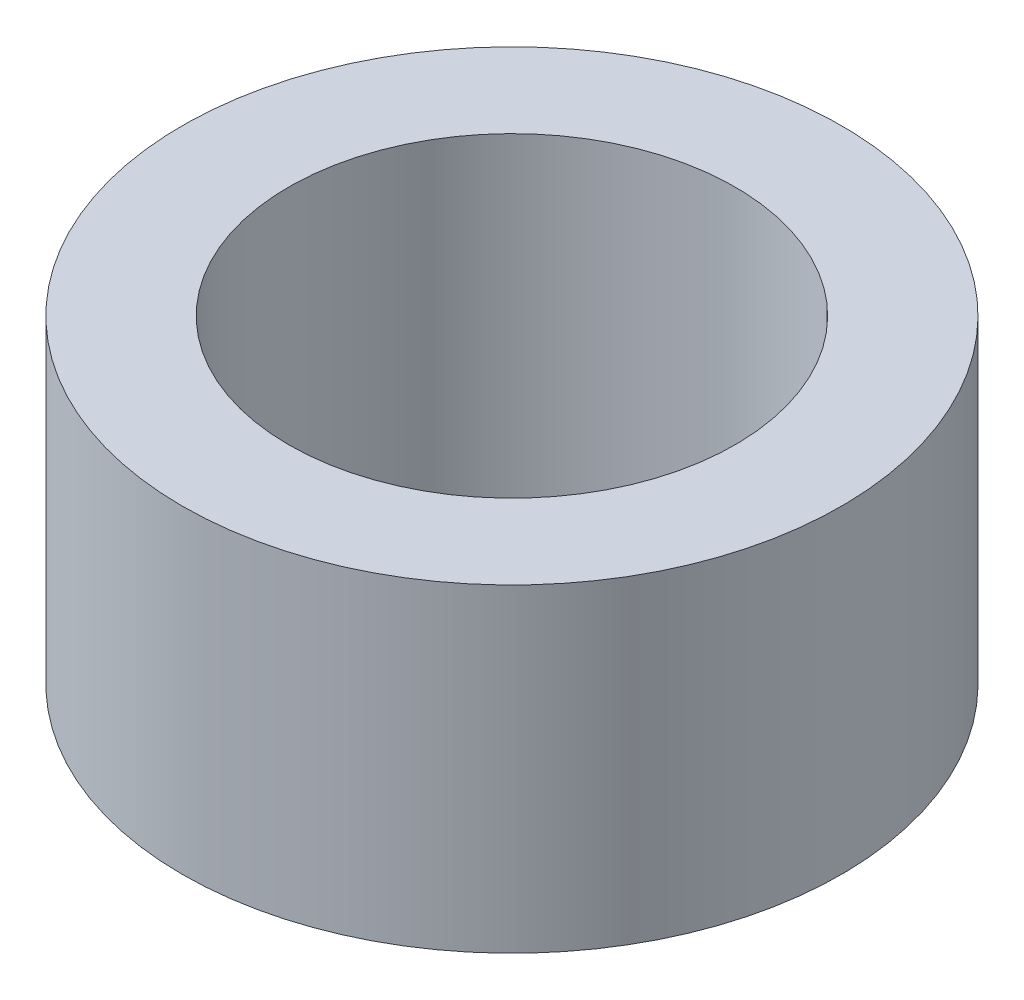
ISO-10303-21;
HEADER;
FILE_DESCRIPTION(('STEP AP214'),'2;1');
FILE_NAME('part.step','',(''),(''),'','','');
FILE_SCHEMA(('AUTOMOTIVE_DESIGN { 1 0 10303 214 1 1 1 1 }'));
ENDSEC;
DATA;
#1=APPLICATION_CONTEXT('core data for automotive mechanical design processes');
#2=APPLICATION_PROTOCOL_DEFINITION('international standard','automotive_design',2000,#1);
#3=PRODUCT_CONTEXT('',#1,'mechanical');
#4=PRODUCT('Part','Part','',(#3));
#5=PRODUCT_RELATED_PRODUCT_CATEGORY('part','',(#4));
#6=PRODUCT_DEFINITION_FORMATION('','',#4);
#7=PRODUCT_DEFINITION_CONTEXT('part definition',#1,'design');
#8=PRODUCT_DEFINITION('design','',#6,#7);
#9=PRODUCT_DEFINITION_SHAPE('','',#8);
#10=(LENGTH_UNIT() NAMED_UNIT(*) SI_UNIT(.MILLI.,.METRE.));
#11=(NAMED_UNIT(*) PLANE_ANGLE_UNIT() SI_UNIT($,.RADIAN.));
#12=(NAMED_UNIT(*) SI_UNIT($,.STERADIAN.) SOLID_ANGLE_UNIT());
#13=UNCERTAINTY_MEASURE_WITH_UNIT(LENGTH_MEASURE(1.E-05),#10,'distance_accuracy_value','');
#14=(GEOMETRIC_REPRESENTATION_CONTEXT(3) GLOBAL_UNCERTAINTY_ASSIGNED_CONTEXT((#13)) GLOBAL_UNIT_ASSIGNED_CONTEXT((#10,
#11,#12)) REPRESENTATION_CONTEXT('',''));
#15=CARTESIAN_POINT('',(0.,0.,0.));
#16=DIRECTION('',(0.,0.,1.));
#17=DIRECTION('',(1.,0.,0.));
#18=AXIS2_PLACEMENT_3D('',#15,#16,#17);
#19=CARTESIAN_POINT('',(0.,3.,0.));
#20=DIRECTION('',(0.,1.,0.));
#21=DIRECTION('',(0.,0.,1.));
#22=AXIS2_PLACEMENT_3D('',#19,#20,#21);
#23=PLANE('',#22);
#24=CARTESIAN_POINT('',(0.,3.,0.));
#25=DIRECTION('',(0.,1.,0.));
#26=DIRECTION('',(0.,0.,1.));
#27=AXIS2_PLACEMENT_3D('',#24,#25,#26);
#28=CIRCLE('',#27,3.1);
#29=CARTESIAN_POINT('',(0.,3.,3.1));
#30=VERTEX_POINT('',#29);
#31=EDGE_CURVE('E10',#30,#30,#28,.T.);
#32=ORIENTED_EDGE('',*,*,#31,.T.);
#33=EDGE_LOOP('',(#32));
#34=FACE_BOUND('',#33,.T.);
#35=CARTESIAN_POINT('',(0.,3.,0.));
#36=DIRECTION('',(0.,1.,0.));
#37=DIRECTION('',(0.,0.,1.));
#38=AXIS2_PLACEMENT_3D('',#35,#36,#37);
#39=CIRCLE('',#38,2.1);
#40=CARTESIAN_POINT('',(0.,3.,2.1));
#41=VERTEX_POINT('',#40);
#42=EDGE_CURVE('E49',#41,#41,#39,.T.);
#43=ORIENTED_EDGE('',*,*,#42,.F.);
#44=EDGE_LOOP('',(#43));
#45=FACE_BOUND('',#44,.T.);
#46=ADVANCED_FACE('F36',(#34,#45),#23,.T.);
#47=CARTESIAN_POINT('',(0.,0.,0.));
#48=DIRECTION('',(0.,1.,0.));
#49=DIRECTION('',(0.,0.,1.));
#50=AXIS2_PLACEMENT_3D('',#47,#48,#49);
#51=PLANE('',#50);
#52=CARTESIAN_POINT('',(0.,0.,0.));
#53=DIRECTION('',(0.,1.,0.));
#54=DIRECTION('',(0.,0.,1.));
#55=AXIS2_PLACEMENT_3D('',#52,#53,#54);
#56=CIRCLE('',#55,3.1);
#57=CARTESIAN_POINT('',(0.,0.,3.1));
#58=VERTEX_POINT('',#57);
#59=EDGE_CURVE('E40',#58,#58,#56,.T.);
#60=ORIENTED_EDGE('',*,*,#59,.F.);
#61=EDGE_LOOP('',(#60));
#62=FACE_BOUND('',#61,.T.);
#63=CARTESIAN_POINT('',(0.,0.,0.));
#64=DIRECTION('',(0.,1.,0.));
#65=DIRECTION('',(0.,0.,1.));
#66=AXIS2_PLACEMENT_3D('',#63,#64,#65);
#67=CIRCLE('',#66,2.1);
#68=CARTESIAN_POINT('',(0.,0.,2.1));
#69=VERTEX_POINT('',#68);
#70=EDGE_CURVE('E51',#69,#69,#67,.T.);
#71=ORIENTED_EDGE('',*,*,#70,.T.);
#72=EDGE_LOOP('',(#71));
#73=FACE_BOUND('',#72,.T.);
#74=ADVANCED_FACE('F63',(#62,#73),#51,.F.);
#75=CARTESIAN_POINT('',(0.,3.,0.));
#76=DIRECTION('',(0.,-1.,0.));
#77=DIRECTION('',(0.,0.,-1.));
#78=AXIS2_PLACEMENT_3D('',#75,#76,#77);
#79=CYLINDRICAL_SURFACE('',#78,3.1);
#80=ORIENTED_EDGE('',*,*,#31,.F.);
#81=EDGE_LOOP('',(#80));
#82=FACE_BOUND('',#81,.T.);
#83=ORIENTED_EDGE('',*,*,#59,.T.);
#84=EDGE_LOOP('',(#83));
#85=FACE_BOUND('',#84,.T.);
#86=ADVANCED_FACE('F38',(#82,#85),#79,.T.);
#87=CARTESIAN_POINT('',(0.,3.,0.));
#88=DIRECTION('',(0.,-1.,0.));
#89=DIRECTION('',(0.,0.,-1.));
#90=AXIS2_PLACEMENT_3D('',#87,#88,#89);
#91=CYLINDRICAL_SURFACE('',#90,2.1);
#92=ORIENTED_EDGE('',*,*,#42,.T.);
#93=EDGE_LOOP('',(#92));
#94=FACE_BOUND('',#93,.T.);
#95=ORIENTED_EDGE('',*,*,#70,.F.);
#96=EDGE_LOOP('',(#95));
#97=FACE_BOUND('',#96,.T.);
#98=ADVANCED_FACE('F59',(#94,#97),#91,.F.);
#99=CLOSED_SHELL('',(#46,#74,#86,#98));
#100=MANIFOLD_SOLID_BREP('B2',#99);
#101=ADVANCED_BREP_SHAPE_REPRESENTATION('',(#18,#100),#14);
#102=SHAPE_DEFINITION_REPRESENTATION(#9,#101);
ENDSEC;
END-ISO-10303-21;
